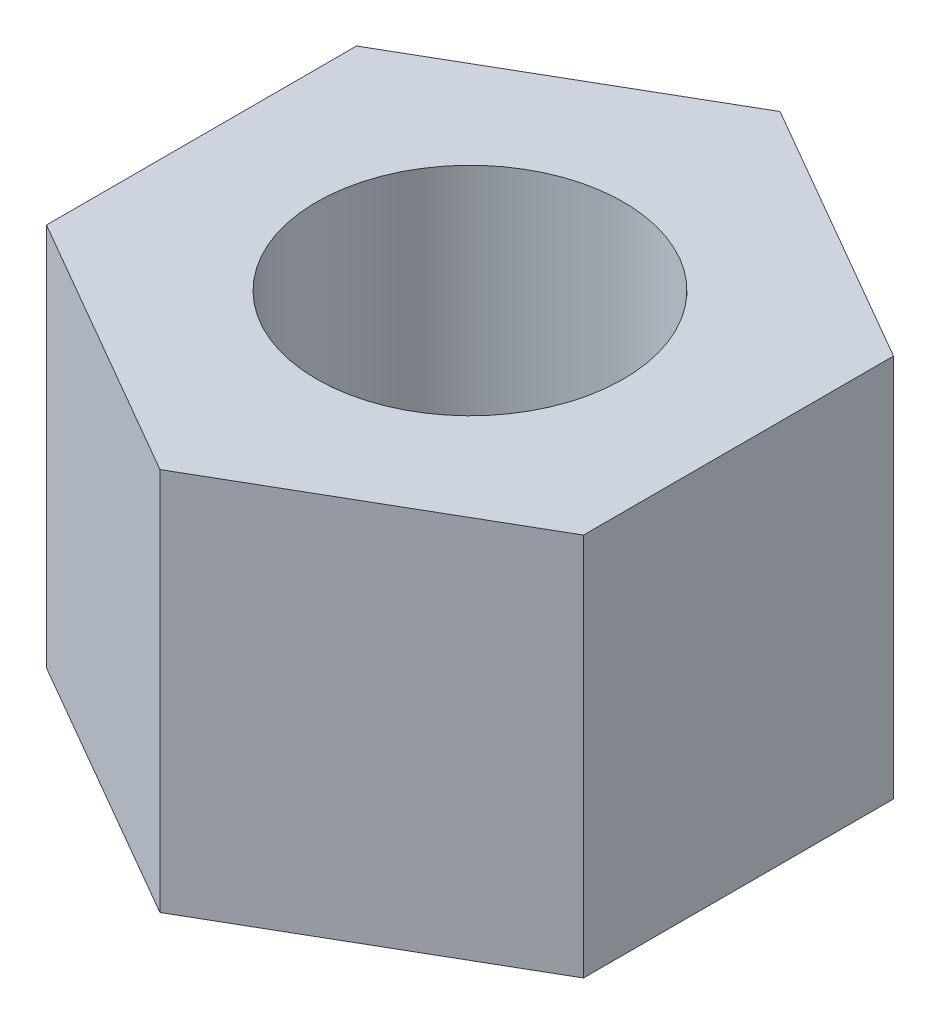
ISO-10303-21;
HEADER;
FILE_DESCRIPTION(('STEP AP214'),'2;1');
FILE_NAME('part.step','',(''),(''),'','','');
FILE_SCHEMA(('AUTOMOTIVE_DESIGN { 1 0 10303 214 1 1 1 1 }'));
ENDSEC;
DATA;
#1=APPLICATION_CONTEXT('core data for automotive mechanical design processes');
#2=APPLICATION_PROTOCOL_DEFINITION('international standard','automotive_design',2000,#1);
#3=PRODUCT_CONTEXT('',#1,'mechanical');
#4=PRODUCT('Part','Part','',(#3));
#5=PRODUCT_RELATED_PRODUCT_CATEGORY('part','',(#4));
#6=PRODUCT_DEFINITION_FORMATION('','',#4);
#7=PRODUCT_DEFINITION_CONTEXT('part definition',#1,'design');
#8=PRODUCT_DEFINITION('design','',#6,#7);
#9=PRODUCT_DEFINITION_SHAPE('','',#8);
#10=(LENGTH_UNIT() NAMED_UNIT(*) SI_UNIT(.MILLI.,.METRE.));
#11=(NAMED_UNIT(*) PLANE_ANGLE_UNIT() SI_UNIT($,.RADIAN.));
#12=(NAMED_UNIT(*) SI_UNIT($,.STERADIAN.) SOLID_ANGLE_UNIT());
#13=UNCERTAINTY_MEASURE_WITH_UNIT(LENGTH_MEASURE(1.E-05),#10,'distance_accuracy_value','');
#14=(GEOMETRIC_REPRESENTATION_CONTEXT(3) GLOBAL_UNCERTAINTY_ASSIGNED_CONTEXT((#13)) GLOBAL_UNIT_ASSIGNED_CONTEXT((#10,
#11,#12)) REPRESENTATION_CONTEXT('',''));
#15=CARTESIAN_POINT('',(0.,0.,0.));
#16=DIRECTION('',(0.,0.,1.));
#17=DIRECTION('',(1.,0.,0.));
#18=AXIS2_PLACEMENT_3D('',#15,#16,#17);
#19=CARTESIAN_POINT('',(0.,5.,0.));
#20=DIRECTION('',(0.,1.,0.));
#21=DIRECTION('',(0.,0.,1.));
#22=AXIS2_PLACEMENT_3D('',#19,#20,#21);
#23=PLANE('',#22);
#24=DIRECTION('',(-0.866025403784438,0.,-0.5));
#25=VECTOR('',#24,1.);
#26=CARTESIAN_POINT('',(3.5,5.,-2.02072594216369));
#27=LINE('',#26,#25);
#28=CARTESIAN_POINT('',(3.5,5.,-2.02072594216369));
#29=VERTEX_POINT('',#28);
#30=CARTESIAN_POINT('',(0.,5.,-4.04145188432738));
#31=VERTEX_POINT('',#30);
#32=EDGE_CURVE('E150',#29,#31,#27,.T.);
#33=ORIENTED_EDGE('',*,*,#32,.T.);
#34=DIRECTION('',(-0.866025403784439,0.,0.5));
#35=VECTOR('',#34,1.);
#36=CARTESIAN_POINT('',(0.,5.,-4.04145188432738));
#37=LINE('',#36,#35);
#38=CARTESIAN_POINT('',(-3.5,5.,-2.02072594216369));
#39=VERTEX_POINT('',#38);
#40=EDGE_CURVE('E98',#31,#39,#37,.T.);
#41=ORIENTED_EDGE('',*,*,#40,.T.);
#42=DIRECTION('',(0.,0.,1.));
#43=VECTOR('',#42,1.);
#44=CARTESIAN_POINT('',(-3.5,5.,-2.02072594216369));
#45=LINE('',#44,#43);
#46=CARTESIAN_POINT('',(-3.5,5.,2.02072594216369));
#47=VERTEX_POINT('',#46);
#48=EDGE_CURVE('E111',#39,#47,#45,.T.);
#49=ORIENTED_EDGE('',*,*,#48,.T.);
#50=DIRECTION('',(0.866025403784439,0.,0.5));
#51=VECTOR('',#50,1.);
#52=CARTESIAN_POINT('',(-3.5,5.,2.02072594216369));
#53=LINE('',#52,#51);
#54=CARTESIAN_POINT('',(0.,5.,4.04145188432738));
#55=VERTEX_POINT('',#54);
#56=EDGE_CURVE('E105',#47,#55,#53,.T.);
#57=ORIENTED_EDGE('',*,*,#56,.T.);
#58=DIRECTION('',(0.866025403784439,0.,-0.5));
#59=VECTOR('',#58,1.);
#60=CARTESIAN_POINT('',(0.,5.,4.04145188432738));
#61=LINE('',#60,#59);
#62=CARTESIAN_POINT('',(3.5,5.,2.02072594216369));
#63=VERTEX_POINT('',#62);
#64=EDGE_CURVE('E109',#55,#63,#61,.T.);
#65=ORIENTED_EDGE('',*,*,#64,.T.);
#66=DIRECTION('',(0.,0.,-1.));
#67=VECTOR('',#66,1.);
#68=CARTESIAN_POINT('',(3.5,5.,2.02072594216369));
#69=LINE('',#68,#67);
#70=EDGE_CURVE('E61',#63,#29,#69,.T.);
#71=ORIENTED_EDGE('',*,*,#70,.T.);
#72=EDGE_LOOP('',(#33,#41,#49,#57,#65,#71));
#73=FACE_BOUND('',#72,.T.);
#74=CARTESIAN_POINT('',(0.,5.,0.));
#75=DIRECTION('',(0.,1.,0.));
#76=DIRECTION('',(0.,0.,1.));
#77=AXIS2_PLACEMENT_3D('',#74,#75,#76);
#78=CIRCLE('',#77,2.);
#79=CARTESIAN_POINT('',(0.,5.,2.));
#80=VERTEX_POINT('',#79);
#81=EDGE_CURVE('E138',#80,#80,#78,.T.);
#82=ORIENTED_EDGE('',*,*,#81,.F.);
#83=EDGE_LOOP('',(#82));
#84=FACE_BOUND('',#83,.T.);
#85=ADVANCED_FACE('F43',(#73,#84),#23,.T.);
#86=CARTESIAN_POINT('',(0.,0.,0.));
#87=DIRECTION('',(0.,1.,0.));
#88=DIRECTION('',(0.,0.,1.));
#89=AXIS2_PLACEMENT_3D('',#86,#87,#88);
#90=PLANE('',#89);
#91=DIRECTION('',(-0.866025403784438,0.,-0.5));
#92=VECTOR('',#91,1.);
#93=CARTESIAN_POINT('',(3.5,0.,-2.02072594216369));
#94=LINE('',#93,#92);
#95=CARTESIAN_POINT('',(3.5,0.,-2.02072594216369));
#96=VERTEX_POINT('',#95);
#97=CARTESIAN_POINT('',(0.,0.,-4.04145188432738));
#98=VERTEX_POINT('',#97);
#99=EDGE_CURVE('E133',#96,#98,#94,.T.);
#100=ORIENTED_EDGE('',*,*,#99,.F.);
#101=DIRECTION('',(0.,0.,-1.));
#102=VECTOR('',#101,1.);
#103=CARTESIAN_POINT('',(3.5,0.,2.02072594216369));
#104=LINE('',#103,#102);
#105=CARTESIAN_POINT('',(3.5,0.,2.02072594216369));
#106=VERTEX_POINT('',#105);
#107=EDGE_CURVE('E90',#106,#96,#104,.T.);
#108=ORIENTED_EDGE('',*,*,#107,.F.);
#109=DIRECTION('',(0.866025403784439,0.,-0.5));
#110=VECTOR('',#109,1.);
#111=CARTESIAN_POINT('',(0.,0.,4.04145188432738));
#112=LINE('',#111,#110);
#113=CARTESIAN_POINT('',(0.,0.,4.04145188432738));
#114=VERTEX_POINT('',#113);
#115=EDGE_CURVE('E84',#114,#106,#112,.T.);
#116=ORIENTED_EDGE('',*,*,#115,.F.);
#117=DIRECTION('',(0.866025403784439,0.,0.5));
#118=VECTOR('',#117,1.);
#119=CARTESIAN_POINT('',(-3.5,0.,2.02072594216369));
#120=LINE('',#119,#118);
#121=CARTESIAN_POINT('',(-3.5,0.,2.02072594216369));
#122=VERTEX_POINT('',#121);
#123=EDGE_CURVE('E120',#122,#114,#120,.T.);
#124=ORIENTED_EDGE('',*,*,#123,.F.);
#125=DIRECTION('',(0.,0.,1.));
#126=VECTOR('',#125,1.);
#127=CARTESIAN_POINT('',(-3.5,0.,-2.02072594216369));
#128=LINE('',#127,#126);
#129=CARTESIAN_POINT('',(-3.5,0.,-2.02072594216369));
#130=VERTEX_POINT('',#129);
#131=EDGE_CURVE('E141',#130,#122,#128,.T.);
#132=ORIENTED_EDGE('',*,*,#131,.F.);
#133=DIRECTION('',(-0.866025403784439,0.,0.5));
#134=VECTOR('',#133,1.);
#135=CARTESIAN_POINT('',(0.,0.,-4.04145188432738));
#136=LINE('',#135,#134);
#137=EDGE_CURVE('E137',#98,#130,#136,.T.);
#138=ORIENTED_EDGE('',*,*,#137,.F.);
#139=EDGE_LOOP('',(#100,#108,#116,#124,#132,#138));
#140=FACE_BOUND('',#139,.T.);
#141=CARTESIAN_POINT('',(0.,0.,0.));
#142=DIRECTION('',(0.,1.,0.));
#143=DIRECTION('',(0.,0.,1.));
#144=AXIS2_PLACEMENT_3D('',#141,#142,#143);
#145=CIRCLE('',#144,2.);
#146=CARTESIAN_POINT('',(0.,0.,2.));
#147=VERTEX_POINT('',#146);
#148=EDGE_CURVE('E265',#147,#147,#145,.T.);
#149=ORIENTED_EDGE('',*,*,#148,.T.);
#150=EDGE_LOOP('',(#149));
#151=FACE_BOUND('',#150,.T.);
#152=ADVANCED_FACE('F163',(#140,#151),#90,.F.);
#153=CARTESIAN_POINT('',(3.5,5.,-2.02072594216369));
#154=DIRECTION('',(-0.5,0.,0.866025403784439));
#155=DIRECTION('',(0.866025403784439,0.,0.5));
#156=AXIS2_PLACEMENT_3D('',#153,#154,#155);
#157=PLANE('',#156);
#158=ORIENTED_EDGE('',*,*,#99,.T.);
#159=DIRECTION('',(0.,-1.,0.));
#160=VECTOR('',#159,1.);
#161=CARTESIAN_POINT('',(0.,5.,-4.04145188432738));
#162=LINE('',#161,#160);
#163=EDGE_CURVE('E11',#31,#98,#162,.T.);
#164=ORIENTED_EDGE('',*,*,#163,.F.);
#165=ORIENTED_EDGE('',*,*,#32,.F.);
#166=DIRECTION('',(0.,-1.,0.));
#167=VECTOR('',#166,1.);
#168=CARTESIAN_POINT('',(3.5,5.,-2.02072594216369));
#169=LINE('',#168,#167);
#170=EDGE_CURVE('E129',#29,#96,#169,.T.);
#171=ORIENTED_EDGE('',*,*,#170,.T.);
#172=EDGE_LOOP('',(#158,#164,#165,#171));
#173=FACE_BOUND('',#172,.T.);
#174=ADVANCED_FACE('F45',(#173),#157,.F.);
#175=CARTESIAN_POINT('',(0.,5.,-4.04145188432738));
#176=DIRECTION('',(0.5,0.,0.866025403784439));
#177=DIRECTION('',(0.866025403784439,0.,-0.5));
#178=AXIS2_PLACEMENT_3D('',#175,#176,#177);
#179=PLANE('',#178);
#180=ORIENTED_EDGE('',*,*,#137,.T.);
#181=DIRECTION('',(0.,-1.,0.));
#182=VECTOR('',#181,1.);
#183=CARTESIAN_POINT('',(-3.5,5.,-2.02072594216369));
#184=LINE('',#183,#182);
#185=EDGE_CURVE('E53',#39,#130,#184,.T.);
#186=ORIENTED_EDGE('',*,*,#185,.F.);
#187=ORIENTED_EDGE('',*,*,#40,.F.);
#188=ORIENTED_EDGE('',*,*,#163,.T.);
#189=EDGE_LOOP('',(#180,#186,#187,#188));
#190=FACE_BOUND('',#189,.T.);
#191=ADVANCED_FACE('F188',(#190),#179,.F.);
#192=CARTESIAN_POINT('',(-3.5,5.,-2.02072594216369));
#193=DIRECTION('',(1.,0.,0.));
#194=DIRECTION('',(0.,0.,-1.));
#195=AXIS2_PLACEMENT_3D('',#192,#193,#194);
#196=PLANE('',#195);
#197=ORIENTED_EDGE('',*,*,#131,.T.);
#198=DIRECTION('',(0.,-1.,0.));
#199=VECTOR('',#198,1.);
#200=CARTESIAN_POINT('',(-3.5,5.,2.02072594216369));
#201=LINE('',#200,#199);
#202=EDGE_CURVE('E122',#47,#122,#201,.T.);
#203=ORIENTED_EDGE('',*,*,#202,.F.);
#204=ORIENTED_EDGE('',*,*,#48,.F.);
#205=ORIENTED_EDGE('',*,*,#185,.T.);
#206=EDGE_LOOP('',(#197,#203,#204,#205));
#207=FACE_BOUND('',#206,.T.);
#208=ADVANCED_FACE('F160',(#207),#196,.F.);
#209=CARTESIAN_POINT('',(-3.5,5.,2.02072594216369));
#210=DIRECTION('',(0.5,0.,-0.866025403784439));
#211=DIRECTION('',(-0.866025403784439,0.,-0.5));
#212=AXIS2_PLACEMENT_3D('',#209,#210,#211);
#213=PLANE('',#212);
#214=ORIENTED_EDGE('',*,*,#123,.T.);
#215=DIRECTION('',(0.,-1.,0.));
#216=VECTOR('',#215,1.);
#217=CARTESIAN_POINT('',(0.,5.,4.04145188432738));
#218=LINE('',#217,#216);
#219=EDGE_CURVE('E117',#55,#114,#218,.T.);
#220=ORIENTED_EDGE('',*,*,#219,.F.);
#221=ORIENTED_EDGE('',*,*,#56,.F.);
#222=ORIENTED_EDGE('',*,*,#202,.T.);
#223=EDGE_LOOP('',(#214,#220,#221,#222));
#224=FACE_BOUND('',#223,.T.);
#225=ADVANCED_FACE('F118',(#224),#213,.F.);
#226=CARTESIAN_POINT('',(0.,5.,4.04145188432738));
#227=DIRECTION('',(-0.5,0.,-0.866025403784439));
#228=DIRECTION('',(-0.866025403784439,0.,0.5));
#229=AXIS2_PLACEMENT_3D('',#226,#227,#228);
#230=PLANE('',#229);
#231=ORIENTED_EDGE('',*,*,#115,.T.);
#232=DIRECTION('',(0.,-1.,0.));
#233=VECTOR('',#232,1.);
#234=CARTESIAN_POINT('',(3.5,5.,2.02072594216369));
#235=LINE('',#234,#233);
#236=EDGE_CURVE('E123',#63,#106,#235,.T.);
#237=ORIENTED_EDGE('',*,*,#236,.F.);
#238=ORIENTED_EDGE('',*,*,#64,.F.);
#239=ORIENTED_EDGE('',*,*,#219,.T.);
#240=EDGE_LOOP('',(#231,#237,#238,#239));
#241=FACE_BOUND('',#240,.T.);
#242=ADVANCED_FACE('F125',(#241),#230,.F.);
#243=CARTESIAN_POINT('',(3.5,5.,2.02072594216369));
#244=DIRECTION('',(-1.,0.,0.));
#245=DIRECTION('',(0.,0.,1.));
#246=AXIS2_PLACEMENT_3D('',#243,#244,#245);
#247=PLANE('',#246);
#248=ORIENTED_EDGE('',*,*,#107,.T.);
#249=ORIENTED_EDGE('',*,*,#170,.F.);
#250=ORIENTED_EDGE('',*,*,#70,.F.);
#251=ORIENTED_EDGE('',*,*,#236,.T.);
#252=EDGE_LOOP('',(#248,#249,#250,#251));
#253=FACE_BOUND('',#252,.T.);
#254=ADVANCED_FACE('F168',(#253),#247,.F.);
#255=CARTESIAN_POINT('',(0.,5.,0.));
#256=DIRECTION('',(0.,-1.,0.));
#257=DIRECTION('',(0.,0.,-1.));
#258=AXIS2_PLACEMENT_3D('',#255,#256,#257);
#259=CYLINDRICAL_SURFACE('',#258,2.);
#260=ORIENTED_EDGE('',*,*,#81,.T.);
#261=EDGE_LOOP('',(#260));
#262=FACE_BOUND('',#261,.T.);
#263=ORIENTED_EDGE('',*,*,#148,.F.);
#264=EDGE_LOOP('',(#263));
#265=FACE_BOUND('',#264,.T.);
#266=ADVANCED_FACE('F170',(#262,#265),#259,.F.);
#267=CLOSED_SHELL('',(#85,#152,#174,#191,#208,#225,#242,#254,#266));
#268=MANIFOLD_SOLID_BREP('B2',#267);
#269=ADVANCED_BREP_SHAPE_REPRESENTATION('',(#18,#268),#14);
#270=SHAPE_DEFINITION_REPRESENTATION(#9,#269);
ENDSEC;
END-ISO-10303-21;
